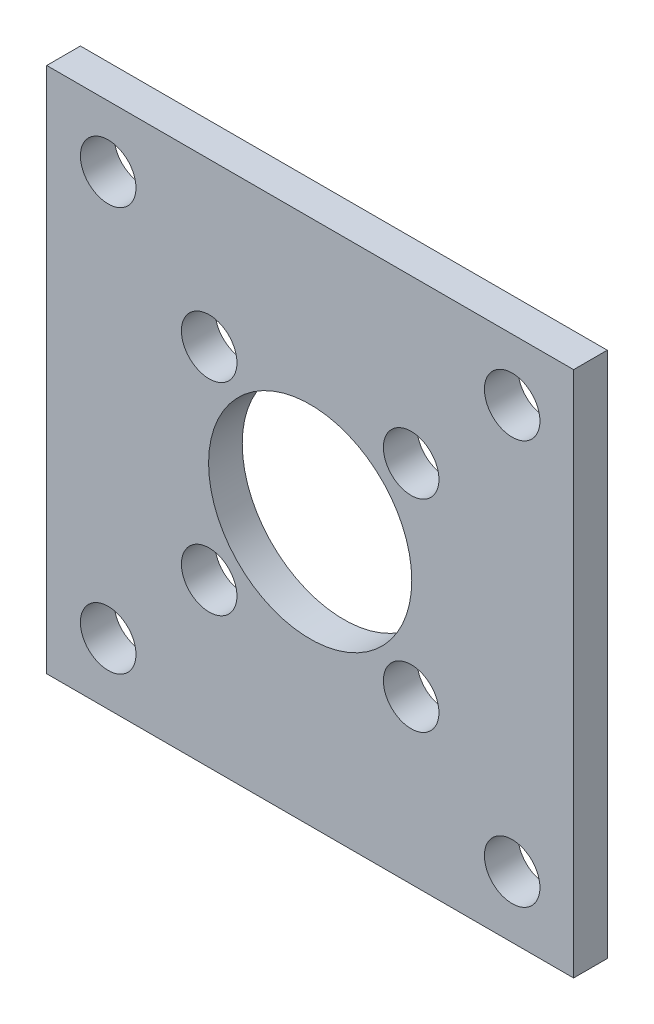
ISO-10303-21;
HEADER;
FILE_DESCRIPTION(('STEP AP214'),'2;1');
FILE_NAME('part.step','',(''),(''),'','','');
FILE_SCHEMA(('AUTOMOTIVE_DESIGN { 1 0 10303 214 1 1 1 1 }'));
ENDSEC;
DATA;
#1=APPLICATION_CONTEXT('core data for automotive mechanical design processes');
#2=APPLICATION_PROTOCOL_DEFINITION('international standard','automotive_design',2000,#1);
#3=PRODUCT_CONTEXT('',#1,'mechanical');
#4=PRODUCT('Part','Part','',(#3));
#5=PRODUCT_RELATED_PRODUCT_CATEGORY('part','',(#4));
#6=PRODUCT_DEFINITION_FORMATION('','',#4);
#7=PRODUCT_DEFINITION_CONTEXT('part definition',#1,'design');
#8=PRODUCT_DEFINITION('design','',#6,#7);
#9=PRODUCT_DEFINITION_SHAPE('','',#8);
#10=(LENGTH_UNIT() NAMED_UNIT(*) SI_UNIT(.MILLI.,.METRE.));
#11=(NAMED_UNIT(*) PLANE_ANGLE_UNIT() SI_UNIT($,.RADIAN.));
#12=(NAMED_UNIT(*) SI_UNIT($,.STERADIAN.) SOLID_ANGLE_UNIT());
#13=UNCERTAINTY_MEASURE_WITH_UNIT(LENGTH_MEASURE(1.E-05),#10,'distance_accuracy_value','');
#14=(GEOMETRIC_REPRESENTATION_CONTEXT(3) GLOBAL_UNCERTAINTY_ASSIGNED_CONTEXT((#13)) GLOBAL_UNIT_ASSIGNED_CONTEXT((#10,
#11,#12)) REPRESENTATION_CONTEXT('',''));
#15=CARTESIAN_POINT('',(0.,0.,0.));
#16=DIRECTION('',(0.,0.,1.));
#17=DIRECTION('',(1.,0.,0.));
#18=AXIS2_PLACEMENT_3D('',#15,#16,#17);
#19=CARTESIAN_POINT('',(0.,0.,5.));
#20=DIRECTION('',(0.,1.,0.));
#21=DIRECTION('',(0.,0.,1.));
#22=AXIS2_PLACEMENT_3D('',#19,#20,#21);
#23=PLANE('',#22);
#24=DIRECTION('',(1.,0.,0.));
#25=VECTOR('',#24,1.);
#26=CARTESIAN_POINT('',(0.,0.,0.));
#27=LINE('',#26,#25);
#28=CARTESIAN_POINT('',(0.,0.,0.));
#29=VERTEX_POINT('',#28);
#30=CARTESIAN_POINT('',(78.25,0.,0.));
#31=VERTEX_POINT('',#30);
#32=EDGE_CURVE('E127',#29,#31,#27,.T.);
#33=ORIENTED_EDGE('',*,*,#32,.T.);
#34=DIRECTION('',(0.,0.,-1.));
#35=VECTOR('',#34,1.);
#36=CARTESIAN_POINT('',(78.25,0.,5.));
#37=LINE('',#36,#35);
#38=CARTESIAN_POINT('',(78.25,0.,5.));
#39=VERTEX_POINT('',#38);
#40=EDGE_CURVE('E11',#39,#31,#37,.T.);
#41=ORIENTED_EDGE('',*,*,#40,.F.);
#42=DIRECTION('',(1.,0.,0.));
#43=VECTOR('',#42,1.);
#44=CARTESIAN_POINT('',(0.,0.,5.));
#45=LINE('',#44,#43);
#46=CARTESIAN_POINT('',(0.,0.,5.));
#47=VERTEX_POINT('',#46);
#48=EDGE_CURVE('E86',#47,#39,#45,.T.);
#49=ORIENTED_EDGE('',*,*,#48,.F.);
#50=DIRECTION('',(0.,0.,-1.));
#51=VECTOR('',#50,1.);
#52=CARTESIAN_POINT('',(0.,0.,5.));
#53=LINE('',#52,#51);
#54=EDGE_CURVE('E52',#47,#29,#53,.T.);
#55=ORIENTED_EDGE('',*,*,#54,.T.);
#56=EDGE_LOOP('',(#33,#41,#49,#55));
#57=FACE_BOUND('',#56,.T.);
#58=ADVANCED_FACE('F35',(#57),#23,.F.);
#59=CARTESIAN_POINT('',(78.25,0.,5.));
#60=DIRECTION('',(-1.,0.,0.));
#61=DIRECTION('',(0.,0.,1.));
#62=AXIS2_PLACEMENT_3D('',#59,#60,#61);
#63=PLANE('',#62);
#64=DIRECTION('',(0.,1.,0.));
#65=VECTOR('',#64,1.);
#66=CARTESIAN_POINT('',(78.25,0.,0.));
#67=LINE('',#66,#65);
#68=CARTESIAN_POINT('',(78.25,78.25,0.));
#69=VERTEX_POINT('',#68);
#70=EDGE_CURVE('E91',#31,#69,#67,.T.);
#71=ORIENTED_EDGE('',*,*,#70,.T.);
#72=DIRECTION('',(0.,0.,-1.));
#73=VECTOR('',#72,1.);
#74=CARTESIAN_POINT('',(78.25,78.25,5.));
#75=LINE('',#74,#73);
#76=CARTESIAN_POINT('',(78.25,78.25,5.));
#77=VERTEX_POINT('',#76);
#78=EDGE_CURVE('E44',#77,#69,#75,.T.);
#79=ORIENTED_EDGE('',*,*,#78,.F.);
#80=DIRECTION('',(0.,1.,0.));
#81=VECTOR('',#80,1.);
#82=CARTESIAN_POINT('',(78.25,0.,5.));
#83=LINE('',#82,#81);
#84=EDGE_CURVE('E77',#39,#77,#83,.T.);
#85=ORIENTED_EDGE('',*,*,#84,.F.);
#86=ORIENTED_EDGE('',*,*,#40,.T.);
#87=EDGE_LOOP('',(#71,#79,#85,#86));
#88=FACE_BOUND('',#87,.T.);
#89=ADVANCED_FACE('F90',(#88),#63,.F.);
#90=CARTESIAN_POINT('',(0.,78.25,5.));
#91=DIRECTION('',(0.,1.,0.));
#92=DIRECTION('',(0.,0.,1.));
#93=AXIS2_PLACEMENT_3D('',#90,#91,#92);
#94=PLANE('',#93);
#95=DIRECTION('',(1.,0.,0.));
#96=VECTOR('',#95,1.);
#97=CARTESIAN_POINT('',(0.,78.25,0.));
#98=LINE('',#97,#96);
#99=CARTESIAN_POINT('',(0.,78.25,0.));
#100=VERTEX_POINT('',#99);
#101=EDGE_CURVE('E130',#100,#69,#98,.T.);
#102=ORIENTED_EDGE('',*,*,#101,.F.);
#103=DIRECTION('',(0.,0.,-1.));
#104=VECTOR('',#103,1.);
#105=CARTESIAN_POINT('',(0.,78.25,5.));
#106=LINE('',#105,#104);
#107=CARTESIAN_POINT('',(0.,78.25,5.));
#108=VERTEX_POINT('',#107);
#109=EDGE_CURVE('E66',#108,#100,#106,.T.);
#110=ORIENTED_EDGE('',*,*,#109,.F.);
#111=DIRECTION('',(1.,0.,0.));
#112=VECTOR('',#111,1.);
#113=CARTESIAN_POINT('',(0.,78.25,5.));
#114=LINE('',#113,#112);
#115=EDGE_CURVE('E85',#108,#77,#114,.T.);
#116=ORIENTED_EDGE('',*,*,#115,.T.);
#117=ORIENTED_EDGE('',*,*,#78,.T.);
#118=EDGE_LOOP('',(#102,#110,#116,#117));
#119=FACE_BOUND('',#118,.T.);
#120=ADVANCED_FACE('F94',(#119),#94,.T.);
#121=CARTESIAN_POINT('',(9.125,9.12500000000001,5.));
#122=DIRECTION('',(0.,0.,-1.));
#123=DIRECTION('',(-1.,0.,0.));
#124=AXIS2_PLACEMENT_3D('',#121,#122,#123);
#125=CYLINDRICAL_SURFACE('',#124,4.125);
#126=CARTESIAN_POINT('',(9.125,9.12500000000001,5.));
#127=DIRECTION('',(0.,0.,1.));
#128=DIRECTION('',(1.,0.,0.));
#129=AXIS2_PLACEMENT_3D('',#126,#127,#128);
#130=CIRCLE('',#129,4.125);
#131=CARTESIAN_POINT('',(13.25,9.12500000000001,5.));
#132=VERTEX_POINT('',#131);
#133=EDGE_CURVE('E109',#132,#132,#130,.T.);
#134=ORIENTED_EDGE('',*,*,#133,.T.);
#135=EDGE_LOOP('',(#134));
#136=FACE_BOUND('',#135,.T.);
#137=CARTESIAN_POINT('',(9.125,9.12500000000001,0.));
#138=DIRECTION('',(0.,0.,1.));
#139=DIRECTION('',(1.,0.,0.));
#140=AXIS2_PLACEMENT_3D('',#137,#138,#139);
#141=CIRCLE('',#140,4.125);
#142=CARTESIAN_POINT('',(13.25,9.12500000000001,0.));
#143=VERTEX_POINT('',#142);
#144=EDGE_CURVE('E144',#143,#143,#141,.T.);
#145=ORIENTED_EDGE('',*,*,#144,.F.);
#146=EDGE_LOOP('',(#145));
#147=FACE_BOUND('',#146,.T.);
#148=ADVANCED_FACE('F225',(#136,#147),#125,.F.);
#149=CARTESIAN_POINT('',(69.125,69.125,5.));
#150=DIRECTION('',(0.,0.,-1.));
#151=DIRECTION('',(-1.,0.,0.));
#152=AXIS2_PLACEMENT_3D('',#149,#150,#151);
#153=CYLINDRICAL_SURFACE('',#152,4.12499999999999);
#154=CARTESIAN_POINT('',(69.125,69.125,5.));
#155=DIRECTION('',(0.,0.,1.));
#156=DIRECTION('',(1.,0.,0.));
#157=AXIS2_PLACEMENT_3D('',#154,#155,#156);
#158=CIRCLE('',#157,4.12499999999999);
#159=CARTESIAN_POINT('',(73.25,69.125,5.));
#160=VERTEX_POINT('',#159);
#161=EDGE_CURVE('E106',#160,#160,#158,.T.);
#162=ORIENTED_EDGE('',*,*,#161,.T.);
#163=EDGE_LOOP('',(#162));
#164=FACE_BOUND('',#163,.T.);
#165=CARTESIAN_POINT('',(69.125,69.125,0.));
#166=DIRECTION('',(0.,0.,1.));
#167=DIRECTION('',(1.,0.,0.));
#168=AXIS2_PLACEMENT_3D('',#165,#166,#167);
#169=CIRCLE('',#168,4.12499999999999);
#170=CARTESIAN_POINT('',(73.25,69.125,0.));
#171=VERTEX_POINT('',#170);
#172=EDGE_CURVE('E141',#171,#171,#169,.T.);
#173=ORIENTED_EDGE('',*,*,#172,.F.);
#174=EDGE_LOOP('',(#173));
#175=FACE_BOUND('',#174,.T.);
#176=ADVANCED_FACE('F227',(#164,#175),#153,.F.);
#177=CARTESIAN_POINT('',(9.125,69.125,5.));
#178=DIRECTION('',(0.,0.,-1.));
#179=DIRECTION('',(-1.,0.,0.));
#180=AXIS2_PLACEMENT_3D('',#177,#178,#179);
#181=CYLINDRICAL_SURFACE('',#180,4.12500000000001);
#182=CARTESIAN_POINT('',(9.125,69.125,5.));
#183=DIRECTION('',(0.,0.,1.));
#184=DIRECTION('',(1.,0.,0.));
#185=AXIS2_PLACEMENT_3D('',#182,#183,#184);
#186=CIRCLE('',#185,4.12500000000001);
#187=CARTESIAN_POINT('',(13.25,69.125,5.));
#188=VERTEX_POINT('',#187);
#189=EDGE_CURVE('E103',#188,#188,#186,.F.);
#190=ORIENTED_EDGE('',*,*,#189,.F.);
#191=EDGE_LOOP('',(#190));
#192=FACE_BOUND('',#191,.T.);
#193=CARTESIAN_POINT('',(9.125,69.125,0.));
#194=DIRECTION('',(0.,0.,1.));
#195=DIRECTION('',(1.,0.,0.));
#196=AXIS2_PLACEMENT_3D('',#193,#194,#195);
#197=CIRCLE('',#196,4.12500000000001);
#198=CARTESIAN_POINT('',(13.25,69.125,0.));
#199=VERTEX_POINT('',#198);
#200=EDGE_CURVE('E138',#199,#199,#197,.F.);
#201=ORIENTED_EDGE('',*,*,#200,.T.);
#202=EDGE_LOOP('',(#201));
#203=FACE_BOUND('',#202,.T.);
#204=ADVANCED_FACE('F234',(#192,#203),#181,.F.);
#205=CARTESIAN_POINT('',(24.125,54.125,5.));
#206=DIRECTION('',(0.,0.,-1.));
#207=DIRECTION('',(-1.,0.,0.));
#208=AXIS2_PLACEMENT_3D('',#205,#206,#207);
#209=CYLINDRICAL_SURFACE('',#208,4.125);
#210=CARTESIAN_POINT('',(24.125,54.125,5.));
#211=DIRECTION('',(0.,0.,1.));
#212=DIRECTION('',(1.,0.,0.));
#213=AXIS2_PLACEMENT_3D('',#210,#211,#212);
#214=CIRCLE('',#213,4.125);
#215=CARTESIAN_POINT('',(28.25,54.125,5.));
#216=VERTEX_POINT('',#215);
#217=EDGE_CURVE('E97',#216,#216,#214,.F.);
#218=ORIENTED_EDGE('',*,*,#217,.F.);
#219=EDGE_LOOP('',(#218));
#220=FACE_BOUND('',#219,.T.);
#221=CARTESIAN_POINT('',(24.125,54.125,0.));
#222=DIRECTION('',(0.,0.,1.));
#223=DIRECTION('',(1.,0.,0.));
#224=AXIS2_PLACEMENT_3D('',#221,#222,#223);
#225=CIRCLE('',#224,4.125);
#226=CARTESIAN_POINT('',(28.25,54.125,0.));
#227=VERTEX_POINT('',#226);
#228=EDGE_CURVE('E135',#227,#227,#225,.F.);
#229=ORIENTED_EDGE('',*,*,#228,.T.);
#230=EDGE_LOOP('',(#229));
#231=FACE_BOUND('',#230,.T.);
#232=ADVANCED_FACE('F240',(#220,#231),#209,.F.);
#233=CARTESIAN_POINT('',(0.,0.,5.));
#234=DIRECTION('',(-1.,0.,0.));
#235=DIRECTION('',(0.,-1.,0.));
#236=AXIS2_PLACEMENT_3D('',#233,#234,#235);
#237=PLANE('',#236);
#238=DIRECTION('',(0.,1.,0.));
#239=VECTOR('',#238,1.);
#240=CARTESIAN_POINT('',(0.,0.,0.));
#241=LINE('',#240,#239);
#242=EDGE_CURVE('E132',#29,#100,#241,.T.);
#243=ORIENTED_EDGE('',*,*,#242,.F.);
#244=ORIENTED_EDGE('',*,*,#54,.F.);
#245=DIRECTION('',(0.,1.,0.));
#246=VECTOR('',#245,1.);
#247=CARTESIAN_POINT('',(0.,0.,5.));
#248=LINE('',#247,#246);
#249=EDGE_CURVE('E95',#47,#108,#248,.T.);
#250=ORIENTED_EDGE('',*,*,#249,.T.);
#251=ORIENTED_EDGE('',*,*,#109,.T.);
#252=EDGE_LOOP('',(#243,#244,#250,#251));
#253=FACE_BOUND('',#252,.T.);
#254=ADVANCED_FACE('F197',(#253),#237,.T.);
#255=CARTESIAN_POINT('',(39.125,39.125,5.));
#256=DIRECTION('',(0.,0.,-1.));
#257=DIRECTION('',(-1.,0.,0.));
#258=AXIS2_PLACEMENT_3D('',#255,#256,#257);
#259=CYLINDRICAL_SURFACE('',#258,15.0882034355964);
#260=CARTESIAN_POINT('',(39.125,39.125,5.));
#261=DIRECTION('',(0.,0.,1.));
#262=DIRECTION('',(1.,0.,0.));
#263=AXIS2_PLACEMENT_3D('',#260,#261,#262);
#264=CIRCLE('',#263,15.0882034355964);
#265=CARTESIAN_POINT('',(54.2132034355964,39.125,5.));
#266=VERTEX_POINT('',#265);
#267=EDGE_CURVE('E165',#266,#266,#264,.T.);
#268=ORIENTED_EDGE('',*,*,#267,.T.);
#269=EDGE_LOOP('',(#268));
#270=FACE_BOUND('',#269,.T.);
#271=CARTESIAN_POINT('',(39.125,39.125,0.));
#272=DIRECTION('',(0.,0.,1.));
#273=DIRECTION('',(1.,0.,0.));
#274=AXIS2_PLACEMENT_3D('',#271,#272,#273);
#275=CIRCLE('',#274,15.0882034355964);
#276=CARTESIAN_POINT('',(54.2132034355964,39.125,0.));
#277=VERTEX_POINT('',#276);
#278=EDGE_CURVE('E124',#277,#277,#275,.T.);
#279=ORIENTED_EDGE('',*,*,#278,.F.);
#280=EDGE_LOOP('',(#279));
#281=FACE_BOUND('',#280,.T.);
#282=ADVANCED_FACE('F169',(#270,#281),#259,.F.);
#283=CARTESIAN_POINT('',(24.125,24.125,5.));
#284=DIRECTION('',(0.,0.,-1.));
#285=DIRECTION('',(-1.,0.,0.));
#286=AXIS2_PLACEMENT_3D('',#283,#284,#285);
#287=CYLINDRICAL_SURFACE('',#286,4.125);
#288=CARTESIAN_POINT('',(24.125,24.125,5.));
#289=DIRECTION('',(0.,0.,1.));
#290=DIRECTION('',(1.,0.,0.));
#291=AXIS2_PLACEMENT_3D('',#288,#289,#290);
#292=CIRCLE('',#291,4.125);
#293=CARTESIAN_POINT('',(28.25,24.125,5.));
#294=VERTEX_POINT('',#293);
#295=EDGE_CURVE('E160',#294,#294,#292,.T.);
#296=ORIENTED_EDGE('',*,*,#295,.T.);
#297=EDGE_LOOP('',(#296));
#298=FACE_BOUND('',#297,.T.);
#299=CARTESIAN_POINT('',(24.125,24.125,0.));
#300=DIRECTION('',(0.,0.,1.));
#301=DIRECTION('',(1.,0.,0.));
#302=AXIS2_PLACEMENT_3D('',#299,#300,#301);
#303=CIRCLE('',#302,4.125);
#304=CARTESIAN_POINT('',(28.25,24.125,0.));
#305=VERTEX_POINT('',#304);
#306=EDGE_CURVE('E121',#305,#305,#303,.T.);
#307=ORIENTED_EDGE('',*,*,#306,.F.);
#308=EDGE_LOOP('',(#307));
#309=FACE_BOUND('',#308,.T.);
#310=ADVANCED_FACE('F196',(#298,#309),#287,.F.);
#311=CARTESIAN_POINT('',(54.125,24.125,5.));
#312=DIRECTION('',(0.,0.,-1.));
#313=DIRECTION('',(-1.,0.,0.));
#314=AXIS2_PLACEMENT_3D('',#311,#312,#313);
#315=CYLINDRICAL_SURFACE('',#314,4.12499999999999);
#316=CARTESIAN_POINT('',(54.125,24.125,5.));
#317=DIRECTION('',(0.,0.,1.));
#318=DIRECTION('',(1.,0.,0.));
#319=AXIS2_PLACEMENT_3D('',#316,#317,#318);
#320=CIRCLE('',#319,4.12499999999999);
#321=CARTESIAN_POINT('',(58.25,24.125,5.));
#322=VERTEX_POINT('',#321);
#323=EDGE_CURVE('E155',#322,#322,#320,.F.);
#324=ORIENTED_EDGE('',*,*,#323,.F.);
#325=EDGE_LOOP('',(#324));
#326=FACE_BOUND('',#325,.T.);
#327=CARTESIAN_POINT('',(54.125,24.125,0.));
#328=DIRECTION('',(0.,0.,1.));
#329=DIRECTION('',(1.,0.,0.));
#330=AXIS2_PLACEMENT_3D('',#327,#328,#329);
#331=CIRCLE('',#330,4.12499999999999);
#332=CARTESIAN_POINT('',(58.25,24.125,0.));
#333=VERTEX_POINT('',#332);
#334=EDGE_CURVE('E118',#333,#333,#331,.F.);
#335=ORIENTED_EDGE('',*,*,#334,.T.);
#336=EDGE_LOOP('',(#335));
#337=FACE_BOUND('',#336,.T.);
#338=ADVANCED_FACE('F199',(#326,#337),#315,.F.);
#339=CARTESIAN_POINT('',(54.125,54.125,5.));
#340=DIRECTION('',(0.,0.,-1.));
#341=DIRECTION('',(-1.,0.,0.));
#342=AXIS2_PLACEMENT_3D('',#339,#340,#341);
#343=CYLINDRICAL_SURFACE('',#342,4.12499999999999);
#344=CARTESIAN_POINT('',(54.125,54.125,5.));
#345=DIRECTION('',(0.,0.,1.));
#346=DIRECTION('',(1.,0.,0.));
#347=AXIS2_PLACEMENT_3D('',#344,#345,#346);
#348=CIRCLE('',#347,4.12499999999999);
#349=CARTESIAN_POINT('',(58.25,54.125,5.));
#350=VERTEX_POINT('',#349);
#351=EDGE_CURVE('E150',#350,#350,#348,.T.);
#352=ORIENTED_EDGE('',*,*,#351,.T.);
#353=EDGE_LOOP('',(#352));
#354=FACE_BOUND('',#353,.T.);
#355=CARTESIAN_POINT('',(54.125,54.125,0.));
#356=DIRECTION('',(0.,0.,1.));
#357=DIRECTION('',(1.,0.,0.));
#358=AXIS2_PLACEMENT_3D('',#355,#356,#357);
#359=CIRCLE('',#358,4.12499999999999);
#360=CARTESIAN_POINT('',(58.25,54.125,0.));
#361=VERTEX_POINT('',#360);
#362=EDGE_CURVE('E115',#361,#361,#359,.T.);
#363=ORIENTED_EDGE('',*,*,#362,.F.);
#364=EDGE_LOOP('',(#363));
#365=FACE_BOUND('',#364,.T.);
#366=ADVANCED_FACE('F37',(#354,#365),#343,.F.);
#367=CARTESIAN_POINT('',(69.125,9.12500000000001,5.));
#368=DIRECTION('',(0.,0.,-1.));
#369=DIRECTION('',(-1.,0.,0.));
#370=AXIS2_PLACEMENT_3D('',#367,#368,#369);
#371=CYLINDRICAL_SURFACE('',#370,4.12499999999998);
#372=CARTESIAN_POINT('',(69.125,9.12500000000001,5.));
#373=DIRECTION('',(0.,0.,1.));
#374=DIRECTION('',(1.,0.,0.));
#375=AXIS2_PLACEMENT_3D('',#372,#373,#374);
#376=CIRCLE('',#375,4.12499999999998);
#377=CARTESIAN_POINT('',(73.25,9.12500000000001,5.));
#378=VERTEX_POINT('',#377);
#379=EDGE_CURVE('E112',#378,#378,#376,.F.);
#380=ORIENTED_EDGE('',*,*,#379,.F.);
#381=EDGE_LOOP('',(#380));
#382=FACE_BOUND('',#381,.T.);
#383=CARTESIAN_POINT('',(69.125,9.12500000000001,0.));
#384=DIRECTION('',(0.,0.,1.));
#385=DIRECTION('',(1.,0.,0.));
#386=AXIS2_PLACEMENT_3D('',#383,#384,#385);
#387=CIRCLE('',#386,4.12499999999998);
#388=CARTESIAN_POINT('',(73.25,9.12500000000001,0.));
#389=VERTEX_POINT('',#388);
#390=EDGE_CURVE('E147',#389,#389,#387,.F.);
#391=ORIENTED_EDGE('',*,*,#390,.T.);
#392=EDGE_LOOP('',(#391));
#393=FACE_BOUND('',#392,.T.);
#394=ADVANCED_FACE('F174',(#382,#393),#371,.F.);
#395=CARTESIAN_POINT('',(0.,0.,5.));
#396=DIRECTION('',(0.,0.,1.));
#397=DIRECTION('',(1.,0.,0.));
#398=AXIS2_PLACEMENT_3D('',#395,#396,#397);
#399=PLANE('',#398);
#400=ORIENTED_EDGE('',*,*,#351,.F.);
#401=EDGE_LOOP('',(#400));
#402=FACE_BOUND('',#401,.T.);
#403=ORIENTED_EDGE('',*,*,#323,.T.);
#404=EDGE_LOOP('',(#403));
#405=FACE_BOUND('',#404,.T.);
#406=ORIENTED_EDGE('',*,*,#295,.F.);
#407=EDGE_LOOP('',(#406));
#408=FACE_BOUND('',#407,.T.);
#409=ORIENTED_EDGE('',*,*,#267,.F.);
#410=EDGE_LOOP('',(#409));
#411=FACE_BOUND('',#410,.T.);
#412=ORIENTED_EDGE('',*,*,#48,.T.);
#413=ORIENTED_EDGE('',*,*,#84,.T.);
#414=ORIENTED_EDGE('',*,*,#115,.F.);
#415=ORIENTED_EDGE('',*,*,#249,.F.);
#416=EDGE_LOOP('',(#412,#413,#414,#415));
#417=FACE_BOUND('',#416,.T.);
#418=ORIENTED_EDGE('',*,*,#217,.T.);
#419=EDGE_LOOP('',(#418));
#420=FACE_BOUND('',#419,.T.);
#421=ORIENTED_EDGE('',*,*,#189,.T.);
#422=EDGE_LOOP('',(#421));
#423=FACE_BOUND('',#422,.T.);
#424=ORIENTED_EDGE('',*,*,#161,.F.);
#425=EDGE_LOOP('',(#424));
#426=FACE_BOUND('',#425,.T.);
#427=ORIENTED_EDGE('',*,*,#133,.F.);
#428=EDGE_LOOP('',(#427));
#429=FACE_BOUND('',#428,.T.);
#430=ORIENTED_EDGE('',*,*,#379,.T.);
#431=EDGE_LOOP('',(#430));
#432=FACE_BOUND('',#431,.T.);
#433=ADVANCED_FACE('F81',(#402,#405,#408,#411,#417,#420,#423,#426,#429,#432),#399,.T.);
#434=CARTESIAN_POINT('',(0.,0.,0.));
#435=DIRECTION('',(0.,0.,1.));
#436=DIRECTION('',(1.,0.,0.));
#437=AXIS2_PLACEMENT_3D('',#434,#435,#436);
#438=PLANE('',#437);
#439=ORIENTED_EDGE('',*,*,#362,.T.);
#440=EDGE_LOOP('',(#439));
#441=FACE_BOUND('',#440,.T.);
#442=ORIENTED_EDGE('',*,*,#334,.F.);
#443=EDGE_LOOP('',(#442));
#444=FACE_BOUND('',#443,.T.);
#445=ORIENTED_EDGE('',*,*,#306,.T.);
#446=EDGE_LOOP('',(#445));
#447=FACE_BOUND('',#446,.T.);
#448=ORIENTED_EDGE('',*,*,#278,.T.);
#449=EDGE_LOOP('',(#448));
#450=FACE_BOUND('',#449,.T.);
#451=ORIENTED_EDGE('',*,*,#32,.F.);
#452=ORIENTED_EDGE('',*,*,#242,.T.);
#453=ORIENTED_EDGE('',*,*,#101,.T.);
#454=ORIENTED_EDGE('',*,*,#70,.F.);
#455=EDGE_LOOP('',(#451,#452,#453,#454));
#456=FACE_BOUND('',#455,.T.);
#457=ORIENTED_EDGE('',*,*,#228,.F.);
#458=EDGE_LOOP('',(#457));
#459=FACE_BOUND('',#458,.T.);
#460=ORIENTED_EDGE('',*,*,#200,.F.);
#461=EDGE_LOOP('',(#460));
#462=FACE_BOUND('',#461,.T.);
#463=ORIENTED_EDGE('',*,*,#172,.T.);
#464=EDGE_LOOP('',(#463));
#465=FACE_BOUND('',#464,.T.);
#466=ORIENTED_EDGE('',*,*,#144,.T.);
#467=EDGE_LOOP('',(#466));
#468=FACE_BOUND('',#467,.T.);
#469=ORIENTED_EDGE('',*,*,#390,.F.);
#470=EDGE_LOOP('',(#469));
#471=FACE_BOUND('',#470,.T.);
#472=ADVANCED_FACE('F173',(#441,#444,#447,#450,#456,#459,#462,#465,#468,#471),#438,.F.);
#473=CLOSED_SHELL('',(#58,#89,#120,#148,#176,#204,#232,#254,#282,#310,#338,#366,#394,#433,#472));
#474=MANIFOLD_SOLID_BREP('B2',#473);
#475=ADVANCED_BREP_SHAPE_REPRESENTATION('',(#18,#474),#14);
#476=SHAPE_DEFINITION_REPRESENTATION(#9,#475);
ENDSEC;
END-ISO-10303-21;
